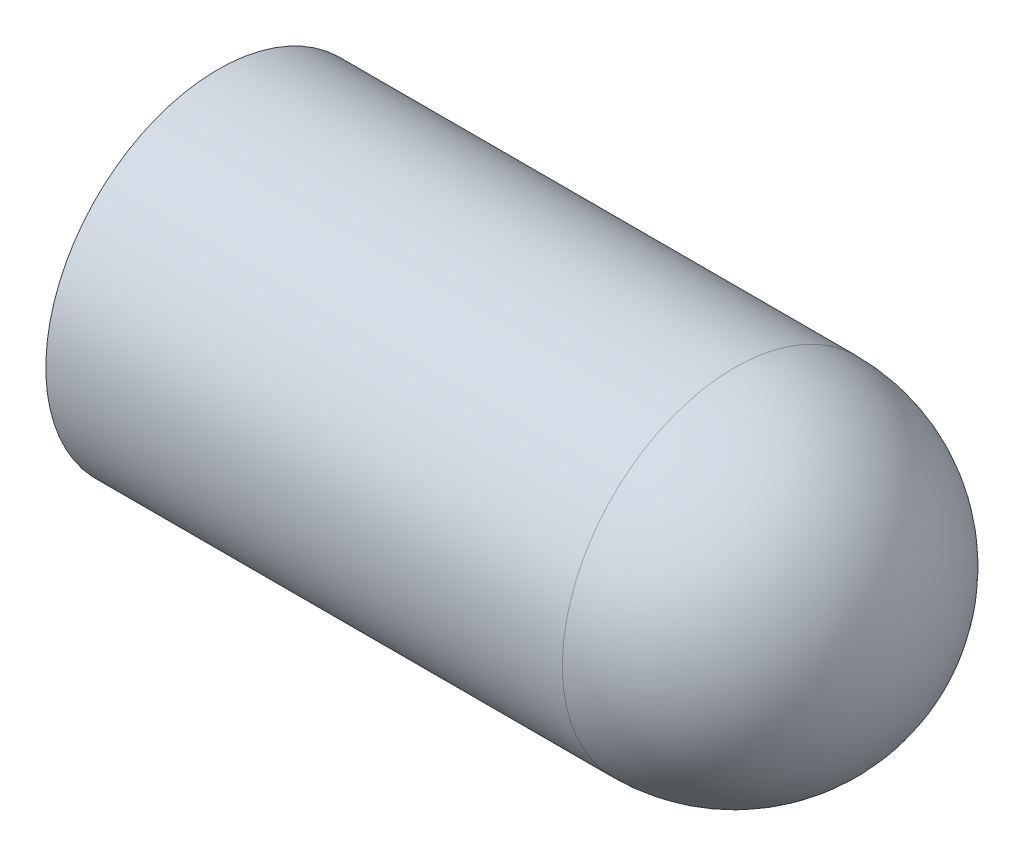
ISO-10303-21;
HEADER;
FILE_DESCRIPTION(('STEP AP214'),'2;1');
FILE_NAME('part.step','',(''),(''),'','','');
FILE_SCHEMA(('AUTOMOTIVE_DESIGN { 1 0 10303 214 1 1 1 1 }'));
ENDSEC;
DATA;
#1=APPLICATION_CONTEXT('core data for automotive mechanical design processes');
#2=APPLICATION_PROTOCOL_DEFINITION('international standard','automotive_design',2000,#1);
#3=PRODUCT_CONTEXT('',#1,'mechanical');
#4=PRODUCT('Part','Part','',(#3));
#5=PRODUCT_RELATED_PRODUCT_CATEGORY('part','',(#4));
#6=PRODUCT_DEFINITION_FORMATION('','',#4);
#7=PRODUCT_DEFINITION_CONTEXT('part definition',#1,'design');
#8=PRODUCT_DEFINITION('design','',#6,#7);
#9=PRODUCT_DEFINITION_SHAPE('','',#8);
#10=(LENGTH_UNIT() NAMED_UNIT(*) SI_UNIT(.MILLI.,.METRE.));
#11=(NAMED_UNIT(*) PLANE_ANGLE_UNIT() SI_UNIT($,.RADIAN.));
#12=(NAMED_UNIT(*) SI_UNIT($,.STERADIAN.) SOLID_ANGLE_UNIT());
#13=UNCERTAINTY_MEASURE_WITH_UNIT(LENGTH_MEASURE(1.E-05),#10,'distance_accuracy_value','');
#14=(GEOMETRIC_REPRESENTATION_CONTEXT(3) GLOBAL_UNCERTAINTY_ASSIGNED_CONTEXT((#13)) GLOBAL_UNIT_ASSIGNED_CONTEXT((#10,
#11,#12)) REPRESENTATION_CONTEXT('',''));
#15=CARTESIAN_POINT('',(0.,0.,0.));
#16=DIRECTION('',(0.,0.,1.));
#17=DIRECTION('',(1.,0.,0.));
#18=AXIS2_PLACEMENT_3D('',#15,#16,#17);
#19=CARTESIAN_POINT('',(7.5,0.,0.));
#20=DIRECTION('',(-1.,0.,0.));
#21=DIRECTION('',(0.,0.,1.));
#22=AXIS2_PLACEMENT_3D('',#19,#20,#21);
#23=CYLINDRICAL_SURFACE('',#22,5.);
#24=CARTESIAN_POINT('',(7.5,0.,0.));
#25=DIRECTION('',(1.,0.,0.));
#26=DIRECTION('',(0.,0.,-1.));
#27=AXIS2_PLACEMENT_3D('',#24,#25,#26);
#28=CIRCLE('',#27,5.);
#29=CARTESIAN_POINT('',(7.5,0.,-5.));
#30=VERTEX_POINT('',#29);
#31=EDGE_CURVE('E10',#30,#30,#28,.T.);
#32=ORIENTED_EDGE('',*,*,#31,.F.);
#33=EDGE_LOOP('',(#32));
#34=FACE_BOUND('',#33,.T.);
#35=CARTESIAN_POINT('',(-7.5,0.,0.));
#36=DIRECTION('',(1.,0.,0.));
#37=DIRECTION('',(0.,0.,-1.));
#38=AXIS2_PLACEMENT_3D('',#35,#36,#37);
#39=CIRCLE('',#38,5.);
#40=CARTESIAN_POINT('',(-7.5,0.,-5.));
#41=VERTEX_POINT('',#40);
#42=EDGE_CURVE('E53',#41,#41,#39,.T.);
#43=ORIENTED_EDGE('',*,*,#42,.T.);
#44=EDGE_LOOP('',(#43));
#45=FACE_BOUND('',#44,.T.);
#46=ADVANCED_FACE('F45',(#34,#45),#23,.T.);
#47=CARTESIAN_POINT('',(7.5,0.,0.));
#48=DIRECTION('',(0.,0.,1.));
#49=DIRECTION('',(1.,0.,0.));
#50=AXIS2_PLACEMENT_3D('',#47,#48,#49);
#51=SPHERICAL_SURFACE('',#50,5.);
#52=CARTESIAN_POINT('',(7.5,0.,0.));
#53=DIRECTION('',(1.,0.,0.));
#54=DIRECTION('',(0.,0.,-1.));
#55=AXIS2_PLACEMENT_3D('',#52,#53,#54);
#56=SPHERICAL_SURFACE('',#55,5.);
#57=ORIENTED_EDGE('',*,*,#31,.T.);
#58=EDGE_LOOP('',(#57));
#59=FACE_BOUND('',#58,.T.);
#60=ADVANCED_FACE('F47',(#59),#56,.T.);
#61=CARTESIAN_POINT('',(-7.5,0.,0.));
#62=DIRECTION('',(1.,0.,0.));
#63=DIRECTION('',(0.,0.,-1.));
#64=AXIS2_PLACEMENT_3D('',#61,#62,#63);
#65=PLANE('',#64);
#66=CARTESIAN_POINT('',(-7.5,0.,0.));
#67=DIRECTION('',(1.,0.,0.));
#68=DIRECTION('',(0.,0.,-1.));
#69=AXIS2_PLACEMENT_3D('',#66,#67,#68);
#70=CIRCLE('',#69,4.);
#71=CARTESIAN_POINT('',(-7.5,0.,-4.));
#72=VERTEX_POINT('',#71);
#73=EDGE_CURVE('E63',#72,#72,#70,.T.);
#74=ORIENTED_EDGE('',*,*,#73,.T.);
#75=EDGE_LOOP('',(#74));
#76=FACE_BOUND('',#75,.T.);
#77=ORIENTED_EDGE('',*,*,#42,.F.);
#78=EDGE_LOOP('',(#77));
#79=FACE_BOUND('',#78,.T.);
#80=ADVANCED_FACE('F70',(#76,#79),#65,.F.);
#81=CARTESIAN_POINT('',(7.5,0.,0.));
#82=DIRECTION('',(-1.,0.,0.));
#83=DIRECTION('',(0.,0.,1.));
#84=AXIS2_PLACEMENT_3D('',#81,#82,#83);
#85=CYLINDRICAL_SURFACE('',#84,4.);
#86=CARTESIAN_POINT('',(7.5,0.,0.));
#87=DIRECTION('',(-1.,0.,0.));
#88=DIRECTION('',(0.,0.,1.));
#89=AXIS2_PLACEMENT_3D('',#86,#87,#88);
#90=CIRCLE('',#89,4.);
#91=CARTESIAN_POINT('',(7.5,0.,4.));
#92=VERTEX_POINT('',#91);
#93=EDGE_CURVE('E58',#92,#92,#90,.F.);
#94=ORIENTED_EDGE('',*,*,#93,.T.);
#95=EDGE_LOOP('',(#94));
#96=FACE_BOUND('',#95,.T.);
#97=ORIENTED_EDGE('',*,*,#73,.F.);
#98=EDGE_LOOP('',(#97));
#99=FACE_BOUND('',#98,.T.);
#100=ADVANCED_FACE('F73',(#96,#99),#85,.F.);
#101=CARTESIAN_POINT('',(7.5,0.,0.));
#102=DIRECTION('',(0.,0.,1.));
#103=DIRECTION('',(1.,0.,0.));
#104=AXIS2_PLACEMENT_3D('',#101,#102,#103);
#105=SPHERICAL_SURFACE('',#104,4.);
#106=CARTESIAN_POINT('',(7.5,0.,0.));
#107=DIRECTION('',(-1.,0.,0.));
#108=DIRECTION('',(0.,0.,1.));
#109=AXIS2_PLACEMENT_3D('',#106,#107,#108);
#110=SPHERICAL_SURFACE('',#109,4.);
#111=ORIENTED_EDGE('',*,*,#93,.F.);
#112=EDGE_LOOP('',(#111));
#113=FACE_BOUND('',#112,.T.);
#114=ADVANCED_FACE('F75',(#113),#110,.F.);
#115=CLOSED_SHELL('',(#46,#60,#80,#100,#114));
#116=MANIFOLD_SOLID_BREP('B2',#115);
#117=ADVANCED_BREP_SHAPE_REPRESENTATION('',(#18,#116),#14);
#118=SHAPE_DEFINITION_REPRESENTATION(#9,#117);
ENDSEC;
END-ISO-10303-21;
